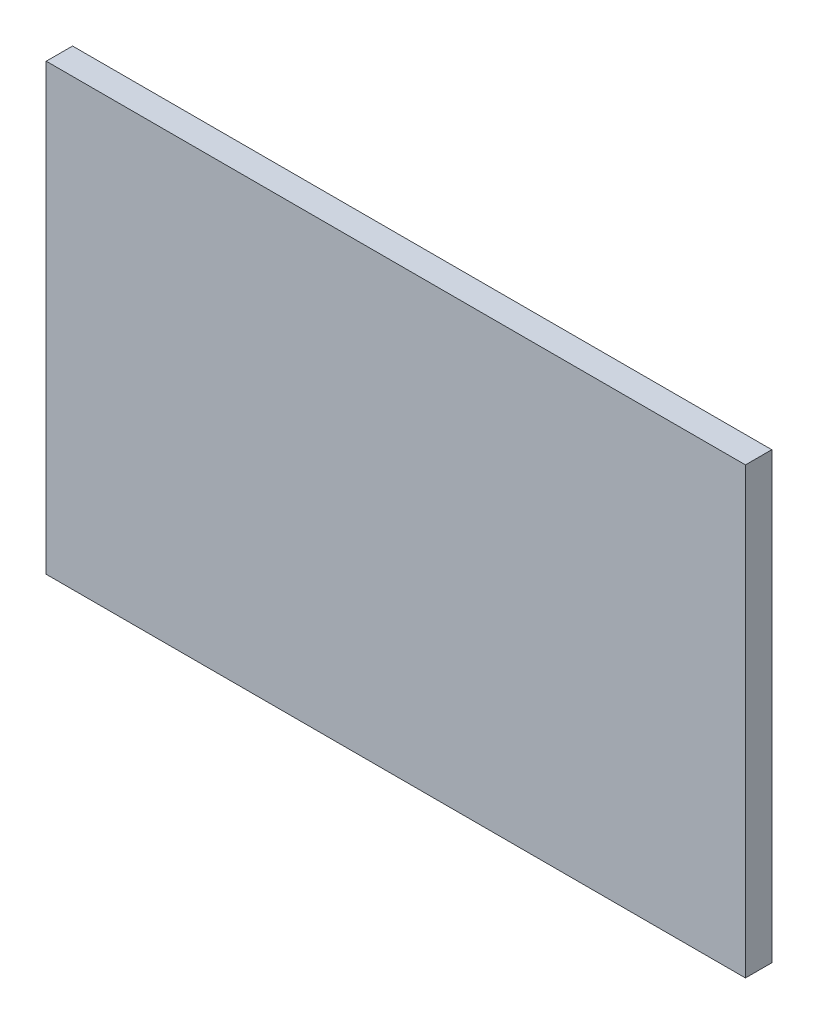
ISO-10303-21;
HEADER;
FILE_DESCRIPTION(('STEP AP214'),'2;1');
FILE_NAME('part.step','',(''),(''),'','','');
FILE_SCHEMA(('AUTOMOTIVE_DESIGN { 1 0 10303 214 1 1 1 1 }'));
ENDSEC;
DATA;
#1=APPLICATION_CONTEXT('core data for automotive mechanical design processes');
#2=APPLICATION_PROTOCOL_DEFINITION('international standard','automotive_design',2000,#1);
#3=PRODUCT_CONTEXT('',#1,'mechanical');
#4=PRODUCT('Part','Part','',(#3));
#5=PRODUCT_RELATED_PRODUCT_CATEGORY('part','',(#4));
#6=PRODUCT_DEFINITION_FORMATION('','',#4);
#7=PRODUCT_DEFINITION_CONTEXT('part definition',#1,'design');
#8=PRODUCT_DEFINITION('design','',#6,#7);
#9=PRODUCT_DEFINITION_SHAPE('','',#8);
#10=(LENGTH_UNIT() NAMED_UNIT(*) SI_UNIT(.MILLI.,.METRE.));
#11=(NAMED_UNIT(*) PLANE_ANGLE_UNIT() SI_UNIT($,.RADIAN.));
#12=(NAMED_UNIT(*) SI_UNIT($,.STERADIAN.) SOLID_ANGLE_UNIT());
#13=UNCERTAINTY_MEASURE_WITH_UNIT(LENGTH_MEASURE(1.E-05),#10,'distance_accuracy_value','');
#14=(GEOMETRIC_REPRESENTATION_CONTEXT(3) GLOBAL_UNCERTAINTY_ASSIGNED_CONTEXT((#13)) GLOBAL_UNIT_ASSIGNED_CONTEXT((#10,
#11,#12)) REPRESENTATION_CONTEXT('',''));
#15=CARTESIAN_POINT('',(0.,0.,0.));
#16=DIRECTION('',(0.,0.,1.));
#17=DIRECTION('',(1.,0.,0.));
#18=AXIS2_PLACEMENT_3D('',#15,#16,#17);
#19=CARTESIAN_POINT('',(-265.684,-168.852160613953,20.));
#20=DIRECTION('',(1.,0.,0.));
#21=DIRECTION('',(0.,0.,-1.));
#22=AXIS2_PLACEMENT_3D('',#19,#20,#21);
#23=PLANE('',#22);
#24=DIRECTION('',(0.,-1.,0.));
#25=VECTOR('',#24,1.);
#26=CARTESIAN_POINT('',(-265.684,-168.852160613953,0.));
#27=LINE('',#26,#25);
#28=CARTESIAN_POINT('',(-265.684,168.852160613952,0.));
#29=VERTEX_POINT('',#28);
#30=CARTESIAN_POINT('',(-265.684,-168.852160613953,0.));
#31=VERTEX_POINT('',#30);
#32=EDGE_CURVE('E99',#29,#31,#27,.T.);
#33=ORIENTED_EDGE('',*,*,#32,.T.);
#34=DIRECTION('',(0.,0.,-1.));
#35=VECTOR('',#34,1.);
#36=CARTESIAN_POINT('',(-265.684,-168.852160613953,20.));
#37=LINE('',#36,#35);
#38=CARTESIAN_POINT('',(-265.684,-168.852160613953,20.));
#39=VERTEX_POINT('',#38);
#40=EDGE_CURVE('E11',#39,#31,#37,.T.);
#41=ORIENTED_EDGE('',*,*,#40,.F.);
#42=DIRECTION('',(0.,-1.,0.));
#43=VECTOR('',#42,1.);
#44=CARTESIAN_POINT('',(-265.684,-168.852160613953,20.));
#45=LINE('',#44,#43);
#46=CARTESIAN_POINT('',(-265.684,168.852160613952,20.));
#47=VERTEX_POINT('',#46);
#48=EDGE_CURVE('E87',#47,#39,#45,.T.);
#49=ORIENTED_EDGE('',*,*,#48,.F.);
#50=DIRECTION('',(0.,0.,-1.));
#51=VECTOR('',#50,1.);
#52=CARTESIAN_POINT('',(-265.684,168.852160613952,20.));
#53=LINE('',#52,#51);
#54=EDGE_CURVE('E95',#47,#29,#53,.T.);
#55=ORIENTED_EDGE('',*,*,#54,.T.);
#56=EDGE_LOOP('',(#33,#41,#49,#55));
#57=FACE_BOUND('',#56,.T.);
#58=ADVANCED_FACE('F36',(#57),#23,.F.);
#59=CARTESIAN_POINT('',(265.684,-168.852160613952,20.));
#60=DIRECTION('',(0.,1.,0.));
#61=DIRECTION('',(-1.,0.,0.));
#62=AXIS2_PLACEMENT_3D('',#59,#60,#61);
#63=PLANE('',#62);
#64=DIRECTION('',(1.,0.,0.));
#65=VECTOR('',#64,1.);
#66=CARTESIAN_POINT('',(265.684,-168.852160613952,0.));
#67=LINE('',#66,#65);
#68=CARTESIAN_POINT('',(265.684,-168.852160613952,0.));
#69=VERTEX_POINT('',#68);
#70=EDGE_CURVE('E91',#31,#69,#67,.T.);
#71=ORIENTED_EDGE('',*,*,#70,.T.);
#72=DIRECTION('',(0.,0.,-1.));
#73=VECTOR('',#72,1.);
#74=CARTESIAN_POINT('',(265.684,-168.852160613952,20.));
#75=LINE('',#74,#73);
#76=CARTESIAN_POINT('',(265.684,-168.852160613952,20.));
#77=VERTEX_POINT('',#76);
#78=EDGE_CURVE('E44',#77,#69,#75,.T.);
#79=ORIENTED_EDGE('',*,*,#78,.F.);
#80=DIRECTION('',(1.,0.,0.));
#81=VECTOR('',#80,1.);
#82=CARTESIAN_POINT('',(265.684,-168.852160613952,20.));
#83=LINE('',#82,#81);
#84=EDGE_CURVE('E82',#39,#77,#83,.T.);
#85=ORIENTED_EDGE('',*,*,#84,.F.);
#86=ORIENTED_EDGE('',*,*,#40,.T.);
#87=EDGE_LOOP('',(#71,#79,#85,#86));
#88=FACE_BOUND('',#87,.T.);
#89=ADVANCED_FACE('F90',(#88),#63,.F.);
#90=CARTESIAN_POINT('',(265.684,-168.852160613952,20.));
#91=DIRECTION('',(-1.,0.,0.));
#92=DIRECTION('',(0.,0.,1.));
#93=AXIS2_PLACEMENT_3D('',#90,#91,#92);
#94=PLANE('',#93);
#95=DIRECTION('',(0.,1.,0.));
#96=VECTOR('',#95,1.);
#97=CARTESIAN_POINT('',(265.684,-168.852160613952,0.));
#98=LINE('',#97,#96);
#99=CARTESIAN_POINT('',(265.684,168.852160613952,0.));
#100=VERTEX_POINT('',#99);
#101=EDGE_CURVE('E69',#69,#100,#98,.T.);
#102=ORIENTED_EDGE('',*,*,#101,.T.);
#103=DIRECTION('',(0.,0.,-1.));
#104=VECTOR('',#103,1.);
#105=CARTESIAN_POINT('',(265.684,168.852160613952,20.));
#106=LINE('',#105,#104);
#107=CARTESIAN_POINT('',(265.684,168.852160613952,20.));
#108=VERTEX_POINT('',#107);
#109=EDGE_CURVE('E92',#108,#100,#106,.T.);
#110=ORIENTED_EDGE('',*,*,#109,.F.);
#111=DIRECTION('',(0.,1.,0.));
#112=VECTOR('',#111,1.);
#113=CARTESIAN_POINT('',(265.684,-168.852160613952,20.));
#114=LINE('',#113,#112);
#115=EDGE_CURVE('E85',#77,#108,#114,.T.);
#116=ORIENTED_EDGE('',*,*,#115,.F.);
#117=ORIENTED_EDGE('',*,*,#78,.T.);
#118=EDGE_LOOP('',(#102,#110,#116,#117));
#119=FACE_BOUND('',#118,.T.);
#120=ADVANCED_FACE('F93',(#119),#94,.F.);
#121=CARTESIAN_POINT('',(265.684,168.852160613952,20.));
#122=DIRECTION('',(0.,-1.,0.));
#123=DIRECTION('',(1.,0.,0.));
#124=AXIS2_PLACEMENT_3D('',#121,#122,#123);
#125=PLANE('',#124);
#126=DIRECTION('',(-1.,0.,0.));
#127=VECTOR('',#126,1.);
#128=CARTESIAN_POINT('',(265.684,168.852160613952,0.));
#129=LINE('',#128,#127);
#130=EDGE_CURVE('E75',#100,#29,#129,.T.);
#131=ORIENTED_EDGE('',*,*,#130,.T.);
#132=ORIENTED_EDGE('',*,*,#54,.F.);
#133=DIRECTION('',(-1.,0.,0.));
#134=VECTOR('',#133,1.);
#135=CARTESIAN_POINT('',(265.684,168.852160613952,20.));
#136=LINE('',#135,#134);
#137=EDGE_CURVE('E52',#108,#47,#136,.T.);
#138=ORIENTED_EDGE('',*,*,#137,.F.);
#139=ORIENTED_EDGE('',*,*,#109,.T.);
#140=EDGE_LOOP('',(#131,#132,#138,#139));
#141=FACE_BOUND('',#140,.T.);
#142=ADVANCED_FACE('F106',(#141),#125,.F.);
#143=CARTESIAN_POINT('',(0.,0.,20.));
#144=DIRECTION('',(0.,0.,1.));
#145=DIRECTION('',(1.,0.,0.));
#146=AXIS2_PLACEMENT_3D('',#143,#144,#145);
#147=PLANE('',#146);
#148=ORIENTED_EDGE('',*,*,#48,.T.);
#149=ORIENTED_EDGE('',*,*,#84,.T.);
#150=ORIENTED_EDGE('',*,*,#115,.T.);
#151=ORIENTED_EDGE('',*,*,#137,.T.);
#152=EDGE_LOOP('',(#148,#149,#150,#151));
#153=FACE_BOUND('',#152,.T.);
#154=ADVANCED_FACE('F83',(#153),#147,.T.);
#155=CARTESIAN_POINT('',(0.,0.,0.));
#156=DIRECTION('',(0.,0.,1.));
#157=DIRECTION('',(1.,0.,0.));
#158=AXIS2_PLACEMENT_3D('',#155,#156,#157);
#159=PLANE('',#158);
#160=ORIENTED_EDGE('',*,*,#32,.F.);
#161=ORIENTED_EDGE('',*,*,#130,.F.);
#162=ORIENTED_EDGE('',*,*,#101,.F.);
#163=ORIENTED_EDGE('',*,*,#70,.F.);
#164=EDGE_LOOP('',(#160,#161,#162,#163));
#165=FACE_BOUND('',#164,.T.);
#166=ADVANCED_FACE('F109',(#165),#159,.F.);
#167=CLOSED_SHELL('',(#58,#89,#120,#142,#154,#166));
#168=MANIFOLD_SOLID_BREP('B2',#167);
#169=ADVANCED_BREP_SHAPE_REPRESENTATION('',(#18,#168),#14);
#170=SHAPE_DEFINITION_REPRESENTATION(#9,#169);
ENDSEC;
END-ISO-10303-21;
